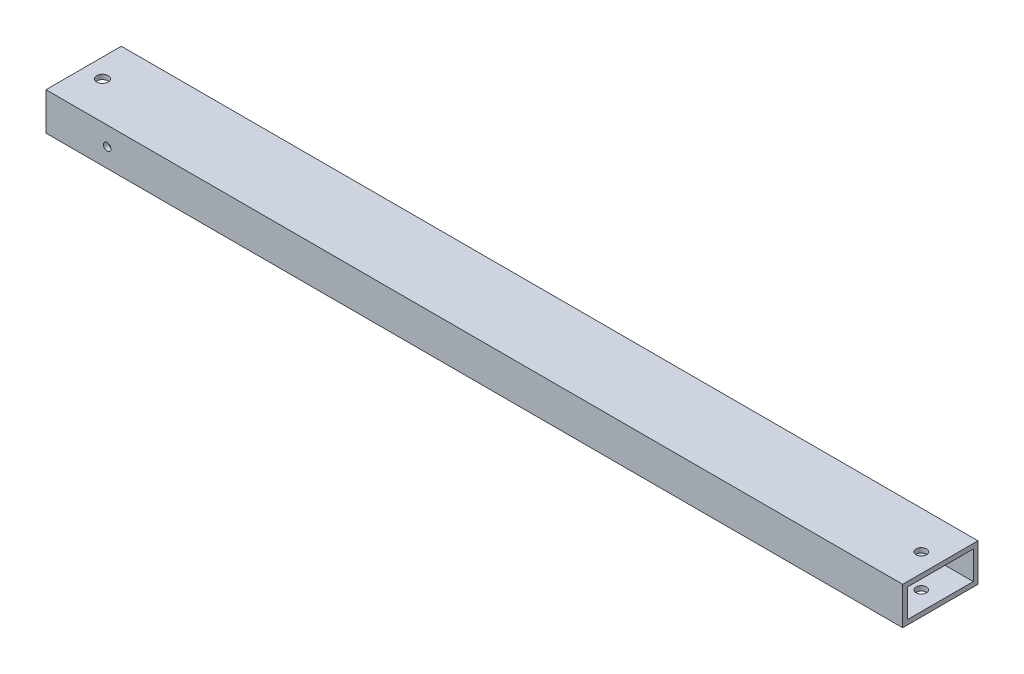
ISO-10303-21;
HEADER;
FILE_DESCRIPTION(('STEP AP214'),'2;1');
FILE_NAME('part.step','',(''),(''),'','','');
FILE_SCHEMA(('AUTOMOTIVE_DESIGN { 1 0 10303 214 1 1 1 1 }'));
ENDSEC;
DATA;
#1=APPLICATION_CONTEXT('core data for automotive mechanical design processes');
#2=APPLICATION_PROTOCOL_DEFINITION('international standard','automotive_design',2000,#1);
#3=PRODUCT_CONTEXT('',#1,'mechanical');
#4=PRODUCT('Part','Part','',(#3));
#5=PRODUCT_RELATED_PRODUCT_CATEGORY('part','',(#4));
#6=PRODUCT_DEFINITION_FORMATION('','',#4);
#7=PRODUCT_DEFINITION_CONTEXT('part definition',#1,'design');
#8=PRODUCT_DEFINITION('design','',#6,#7);
#9=PRODUCT_DEFINITION_SHAPE('','',#8);
#10=(LENGTH_UNIT() NAMED_UNIT(*) SI_UNIT(.MILLI.,.METRE.));
#11=(NAMED_UNIT(*) PLANE_ANGLE_UNIT() SI_UNIT($,.RADIAN.));
#12=(NAMED_UNIT(*) SI_UNIT($,.STERADIAN.) SOLID_ANGLE_UNIT());
#13=UNCERTAINTY_MEASURE_WITH_UNIT(LENGTH_MEASURE(1.E-05),#10,'distance_accuracy_value','');
#14=(GEOMETRIC_REPRESENTATION_CONTEXT(3) GLOBAL_UNCERTAINTY_ASSIGNED_CONTEXT((#13)) GLOBAL_UNIT_ASSIGNED_CONTEXT((#10,
#11,#12)) REPRESENTATION_CONTEXT('',''));
#15=CARTESIAN_POINT('',(0.,0.,0.));
#16=DIRECTION('',(0.,0.,1.));
#17=DIRECTION('',(1.,0.,0.));
#18=AXIS2_PLACEMENT_3D('',#15,#16,#17);
#19=CARTESIAN_POINT('',(238.313908971209,-181.299072168841,-866.236135779287));
#20=DIRECTION('',(0.,1.,0.));
#21=DIRECTION('',(0.,0.,1.));
#22=AXIS2_PLACEMENT_3D('',#19,#20,#21);
#23=CYLINDRICAL_SURFACE('',#22,5.5);
#24=CARTESIAN_POINT('',(238.313908971209,-141.299072168841,-866.236135779287));
#25=DIRECTION('',(0.,1.,0.));
#26=DIRECTION('',(0.,0.,1.));
#27=AXIS2_PLACEMENT_3D('',#24,#25,#26);
#28=CIRCLE('',#27,5.5);
#29=CARTESIAN_POINT('',(238.313908971209,-141.299072168841,-860.736135779287));
#30=VERTEX_POINT('',#29);
#31=EDGE_CURVE('E20',#30,#30,#28,.F.);
#32=ORIENTED_EDGE('',*,*,#31,.F.);
#33=EDGE_LOOP('',(#32));
#34=FACE_BOUND('',#33,.T.);
#35=CARTESIAN_POINT('',(238.313908971209,-146.29907216884,-866.236135779287));
#36=DIRECTION('',(0.,1.,0.));
#37=DIRECTION('',(0.,0.,1.));
#38=AXIS2_PLACEMENT_3D('',#35,#36,#37);
#39=CIRCLE('',#38,5.5);
#40=CARTESIAN_POINT('',(238.313908971209,-146.29907216884,-860.736135779287));
#41=VERTEX_POINT('',#40);
#42=EDGE_CURVE('E123',#41,#41,#39,.F.);
#43=ORIENTED_EDGE('',*,*,#42,.T.);
#44=EDGE_LOOP('',(#43));
#45=FACE_BOUND('',#44,.T.);
#46=ADVANCED_FACE('F17',(#34,#45),#23,.F.);
#47=CARTESIAN_POINT('',(-631.679347611488,-141.299072168841,-866.486147986318));
#48=DIRECTION('',(0.,1.,0.));
#49=DIRECTION('',(0.,0.,1.));
#50=AXIS2_PLACEMENT_3D('',#47,#48,#49);
#51=CYLINDRICAL_SURFACE('',#50,6.);
#52=CARTESIAN_POINT('',(-631.679347611488,-146.29907216884,-866.486147986318));
#53=DIRECTION('',(0.,1.,0.));
#54=DIRECTION('',(0.,0.,1.));
#55=AXIS2_PLACEMENT_3D('',#52,#53,#54);
#56=CIRCLE('',#55,6.);
#57=CARTESIAN_POINT('',(-631.679347611488,-146.29907216884,-860.486147986318));
#58=VERTEX_POINT('',#57);
#59=EDGE_CURVE('E99',#58,#58,#56,.F.);
#60=ORIENTED_EDGE('',*,*,#59,.T.);
#61=EDGE_LOOP('',(#60));
#62=FACE_BOUND('',#61,.T.);
#63=CARTESIAN_POINT('',(-631.679347611488,-141.299072168841,-866.486147986318));
#64=DIRECTION('',(0.,1.,0.));
#65=DIRECTION('',(0.,0.,1.));
#66=AXIS2_PLACEMENT_3D('',#63,#64,#65);
#67=CIRCLE('',#66,6.);
#68=CARTESIAN_POINT('',(-631.679347611488,-141.299072168841,-860.486147986318));
#69=VERTEX_POINT('',#68);
#70=EDGE_CURVE('E151',#69,#69,#67,.F.);
#71=ORIENTED_EDGE('',*,*,#70,.F.);
#72=EDGE_LOOP('',(#71));
#73=FACE_BOUND('',#72,.T.);
#74=ADVANCED_FACE('F163',(#62,#73),#51,.F.);
#75=CARTESIAN_POINT('',(-586.679347611488,-161.35907216884,-898.986147986318));
#76=DIRECTION('',(0.,0.,-1.));
#77=DIRECTION('',(-1.,0.,0.));
#78=AXIS2_PLACEMENT_3D('',#75,#76,#77);
#79=CYLINDRICAL_SURFACE('',#78,4.);
#80=CARTESIAN_POINT('',(-586.679347611488,-161.35907216884,-906.486147986318));
#81=DIRECTION('',(0.,0.,-1.));
#82=DIRECTION('',(-1.,0.,0.));
#83=AXIS2_PLACEMENT_3D('',#80,#81,#82);
#84=CIRCLE('',#83,4.);
#85=CARTESIAN_POINT('',(-590.679347611488,-161.35907216884,-906.486147986318));
#86=VERTEX_POINT('',#85);
#87=EDGE_CURVE('E115',#86,#86,#84,.F.);
#88=ORIENTED_EDGE('',*,*,#87,.F.);
#89=EDGE_LOOP('',(#88));
#90=FACE_BOUND('',#89,.T.);
#91=CARTESIAN_POINT('',(-586.679347611488,-161.35907216884,-901.486147986318));
#92=DIRECTION('',(0.,0.,-1.));
#93=DIRECTION('',(-1.,0.,0.));
#94=AXIS2_PLACEMENT_3D('',#91,#92,#93);
#95=CIRCLE('',#94,4.);
#96=CARTESIAN_POINT('',(-590.679347611488,-161.35907216884,-901.486147986318));
#97=VERTEX_POINT('',#96);
#98=EDGE_CURVE('E124',#97,#97,#95,.F.);
#99=ORIENTED_EDGE('',*,*,#98,.T.);
#100=EDGE_LOOP('',(#99));
#101=FACE_BOUND('',#100,.T.);
#102=ADVANCED_FACE('F264',(#90,#101),#79,.F.);
#103=CARTESIAN_POINT('',(-586.679347611488,-161.35907216884,-833.986147986319));
#104=DIRECTION('',(0.,0.,1.));
#105=DIRECTION('',(1.,0.,0.));
#106=AXIS2_PLACEMENT_3D('',#103,#104,#105);
#107=CYLINDRICAL_SURFACE('',#106,4.);
#108=CARTESIAN_POINT('',(-586.679347611488,-161.35907216884,-831.486147986319));
#109=DIRECTION('',(0.,0.,1.));
#110=DIRECTION('',(1.,0.,0.));
#111=AXIS2_PLACEMENT_3D('',#108,#109,#110);
#112=CIRCLE('',#111,4.);
#113=CARTESIAN_POINT('',(-582.679347611488,-161.35907216884,-831.486147986319));
#114=VERTEX_POINT('',#113);
#115=EDGE_CURVE('E98',#114,#114,#112,.F.);
#116=ORIENTED_EDGE('',*,*,#115,.T.);
#117=EDGE_LOOP('',(#116));
#118=FACE_BOUND('',#117,.T.);
#119=CARTESIAN_POINT('',(-586.679347611488,-161.35907216884,-826.486147986318));
#120=DIRECTION('',(0.,0.,1.));
#121=DIRECTION('',(1.,0.,0.));
#122=AXIS2_PLACEMENT_3D('',#119,#120,#121);
#123=CIRCLE('',#122,4.);
#124=CARTESIAN_POINT('',(-582.679347611488,-161.35907216884,-826.486147986318));
#125=VERTEX_POINT('',#124);
#126=EDGE_CURVE('E137',#125,#125,#123,.F.);
#127=ORIENTED_EDGE('',*,*,#126,.F.);
#128=EDGE_LOOP('',(#127));
#129=FACE_BOUND('',#128,.T.);
#130=ADVANCED_FACE('F259',(#118,#129),#107,.F.);
#131=CARTESIAN_POINT('',(-201.679347611488,-141.299072168841,-866.486147986318));
#132=DIRECTION('',(0.,1.,0.));
#133=DIRECTION('',(0.,0.,1.));
#134=AXIS2_PLACEMENT_3D('',#131,#132,#133);
#135=PLANE('',#134);
#136=ORIENTED_EDGE('',*,*,#70,.T.);
#137=EDGE_LOOP('',(#136));
#138=FACE_BOUND('',#137,.T.);
#139=ORIENTED_EDGE('',*,*,#31,.T.);
#140=EDGE_LOOP('',(#139));
#141=FACE_BOUND('',#140,.T.);
#142=DIRECTION('',(-1.,0.,0.));
#143=VECTOR('',#142,1.);
#144=CARTESIAN_POINT('',(-201.679347611488,-141.299072168841,-906.486147986318));
#145=LINE('',#144,#143);
#146=CARTESIAN_POINT('',(-651.679347611489,-141.299072168841,-906.486147986318));
#147=VERTEX_POINT('',#146);
#148=CARTESIAN_POINT('',(258.313908971212,-141.299072168841,-906.486147986318));
#149=VERTEX_POINT('',#148);
#150=EDGE_CURVE('E116',#147,#149,#145,.F.);
#151=ORIENTED_EDGE('',*,*,#150,.F.);
#152=DIRECTION('',(0.,0.,1.));
#153=VECTOR('',#152,1.);
#154=CARTESIAN_POINT('',(-651.679347611489,-141.299072168841,-866.486147986318));
#155=LINE('',#154,#153);
#156=CARTESIAN_POINT('',(-651.679347611489,-141.299072168841,-826.486147986318));
#157=VERTEX_POINT('',#156);
#158=EDGE_CURVE('E232',#157,#147,#155,.F.);
#159=ORIENTED_EDGE('',*,*,#158,.F.);
#160=DIRECTION('',(1.,0.,0.));
#161=VECTOR('',#160,1.);
#162=CARTESIAN_POINT('',(-201.679347611488,-141.299072168841,-826.486147986318));
#163=LINE('',#162,#161);
#164=CARTESIAN_POINT('',(258.313908971212,-141.299072168841,-826.486147986318));
#165=VERTEX_POINT('',#164);
#166=EDGE_CURVE('E141',#165,#157,#163,.F.);
#167=ORIENTED_EDGE('',*,*,#166,.F.);
#168=DIRECTION('',(0.,0.,1.));
#169=VECTOR('',#168,1.);
#170=CARTESIAN_POINT('',(258.313908971212,-141.299072168841,-866.486147986318));
#171=LINE('',#170,#169);
#172=EDGE_CURVE('E112',#165,#149,#171,.F.);
#173=ORIENTED_EDGE('',*,*,#172,.T.);
#174=EDGE_LOOP('',(#151,#159,#167,#173));
#175=FACE_BOUND('',#174,.T.);
#176=ADVANCED_FACE('F158',(#138,#141,#175),#135,.T.);
#177=CARTESIAN_POINT('',(-201.679347611488,-161.299072168841,-901.486147986318));
#178=DIRECTION('',(0.,0.,-1.));
#179=DIRECTION('',(-1.,0.,0.));
#180=AXIS2_PLACEMENT_3D('',#177,#178,#179);
#181=PLANE('',#180);
#182=ORIENTED_EDGE('',*,*,#98,.F.);
#183=EDGE_LOOP('',(#182));
#184=FACE_BOUND('',#183,.T.);
#185=DIRECTION('',(0.,1.,0.));
#186=VECTOR('',#185,1.);
#187=CARTESIAN_POINT('',(-651.679347611489,-161.299072168841,-901.486147986318));
#188=LINE('',#187,#186);
#189=CARTESIAN_POINT('',(-651.679347611489,-176.299072168841,-901.486147986318));
#190=VERTEX_POINT('',#189);
#191=CARTESIAN_POINT('',(-651.679347611489,-146.29907216884,-901.486147986318));
#192=VERTEX_POINT('',#191);
#193=EDGE_CURVE('E227',#190,#192,#188,.T.);
#194=ORIENTED_EDGE('',*,*,#193,.F.);
#195=DIRECTION('',(1.,0.,0.));
#196=VECTOR('',#195,1.);
#197=CARTESIAN_POINT('',(-201.679347611488,-176.299072168841,-901.486147986318));
#198=LINE('',#197,#196);
#199=CARTESIAN_POINT('',(258.313908971212,-176.299072168841,-901.486147986318));
#200=VERTEX_POINT('',#199);
#201=EDGE_CURVE('E119',#190,#200,#198,.T.);
#202=ORIENTED_EDGE('',*,*,#201,.T.);
#203=DIRECTION('',(0.,1.,0.));
#204=VECTOR('',#203,1.);
#205=CARTESIAN_POINT('',(258.313908971212,-161.299072168841,-901.486147986318));
#206=LINE('',#205,#204);
#207=CARTESIAN_POINT('',(258.313908971212,-146.29907216884,-901.486147986318));
#208=VERTEX_POINT('',#207);
#209=EDGE_CURVE('E107',#200,#208,#206,.T.);
#210=ORIENTED_EDGE('',*,*,#209,.T.);
#211=DIRECTION('',(1.,0.,0.));
#212=VECTOR('',#211,1.);
#213=CARTESIAN_POINT('',(-201.679347611488,-146.29907216884,-901.486147986318));
#214=LINE('',#213,#212);
#215=EDGE_CURVE('E84',#208,#192,#214,.F.);
#216=ORIENTED_EDGE('',*,*,#215,.T.);
#217=EDGE_LOOP('',(#194,#202,#210,#216));
#218=FACE_BOUND('',#217,.T.);
#219=ADVANCED_FACE('F167',(#184,#218),#181,.F.);
#220=CARTESIAN_POINT('',(-201.679347611488,-146.29907216884,-866.486147986318));
#221=DIRECTION('',(0.,1.,0.));
#222=DIRECTION('',(0.,0.,1.));
#223=AXIS2_PLACEMENT_3D('',#220,#221,#222);
#224=PLANE('',#223);
#225=ORIENTED_EDGE('',*,*,#59,.F.);
#226=EDGE_LOOP('',(#225));
#227=FACE_BOUND('',#226,.T.);
#228=ORIENTED_EDGE('',*,*,#42,.F.);
#229=EDGE_LOOP('',(#228));
#230=FACE_BOUND('',#229,.T.);
#231=DIRECTION('',(0.,0.,1.));
#232=VECTOR('',#231,1.);
#233=CARTESIAN_POINT('',(-651.679347611489,-146.29907216884,-866.486147986318));
#234=LINE('',#233,#232);
#235=CARTESIAN_POINT('',(-651.679347611489,-146.29907216884,-831.486147986319));
#236=VERTEX_POINT('',#235);
#237=EDGE_CURVE('E225',#192,#236,#234,.T.);
#238=ORIENTED_EDGE('',*,*,#237,.F.);
#239=ORIENTED_EDGE('',*,*,#215,.F.);
#240=DIRECTION('',(0.,0.,1.));
#241=VECTOR('',#240,1.);
#242=CARTESIAN_POINT('',(258.313908971212,-146.29907216884,-866.486147986318));
#243=LINE('',#242,#241);
#244=CARTESIAN_POINT('',(258.313908971212,-146.29907216884,-831.486147986319));
#245=VERTEX_POINT('',#244);
#246=EDGE_CURVE('E78',#208,#245,#243,.T.);
#247=ORIENTED_EDGE('',*,*,#246,.T.);
#248=DIRECTION('',(1.,0.,0.));
#249=VECTOR('',#248,1.);
#250=CARTESIAN_POINT('',(-201.679347611488,-146.29907216884,-831.486147986319));
#251=LINE('',#250,#249);
#252=EDGE_CURVE('E82',#245,#236,#251,.F.);
#253=ORIENTED_EDGE('',*,*,#252,.T.);
#254=EDGE_LOOP('',(#238,#239,#247,#253));
#255=FACE_BOUND('',#254,.T.);
#256=ADVANCED_FACE('F81',(#227,#230,#255),#224,.F.);
#257=CARTESIAN_POINT('',(-201.679347611488,-161.299072168841,-831.486147986319));
#258=DIRECTION('',(0.,0.,1.));
#259=DIRECTION('',(1.,0.,0.));
#260=AXIS2_PLACEMENT_3D('',#257,#258,#259);
#261=PLANE('',#260);
#262=ORIENTED_EDGE('',*,*,#115,.F.);
#263=EDGE_LOOP('',(#262));
#264=FACE_BOUND('',#263,.T.);
#265=DIRECTION('',(0.,1.,0.));
#266=VECTOR('',#265,1.);
#267=CARTESIAN_POINT('',(-651.679347611489,-161.299072168841,-831.486147986319));
#268=LINE('',#267,#266);
#269=CARTESIAN_POINT('',(-651.679347611489,-176.299072168841,-831.486147986319));
#270=VERTEX_POINT('',#269);
#271=EDGE_CURVE('E96',#236,#270,#268,.F.);
#272=ORIENTED_EDGE('',*,*,#271,.F.);
#273=ORIENTED_EDGE('',*,*,#252,.F.);
#274=DIRECTION('',(0.,1.,0.));
#275=VECTOR('',#274,1.);
#276=CARTESIAN_POINT('',(258.313908971212,-161.299072168841,-831.486147986319));
#277=LINE('',#276,#275);
#278=CARTESIAN_POINT('',(258.313908971212,-176.299072168841,-831.486147986319));
#279=VERTEX_POINT('',#278);
#280=EDGE_CURVE('E89',#245,#279,#277,.F.);
#281=ORIENTED_EDGE('',*,*,#280,.T.);
#282=DIRECTION('',(1.,0.,0.));
#283=VECTOR('',#282,1.);
#284=CARTESIAN_POINT('',(-201.679347611488,-176.299072168841,-831.486147986319));
#285=LINE('',#284,#283);
#286=EDGE_CURVE('E121',#279,#270,#285,.F.);
#287=ORIENTED_EDGE('',*,*,#286,.T.);
#288=EDGE_LOOP('',(#272,#273,#281,#287));
#289=FACE_BOUND('',#288,.T.);
#290=ADVANCED_FACE('F93',(#264,#289),#261,.F.);
#291=CARTESIAN_POINT('',(-201.679347611488,-176.299072168841,-866.486147986318));
#292=DIRECTION('',(0.,-1.,0.));
#293=DIRECTION('',(0.,0.,-1.));
#294=AXIS2_PLACEMENT_3D('',#291,#292,#293);
#295=PLANE('',#294);
#296=CARTESIAN_POINT('',(-631.679347611488,-176.299072168841,-866.486147986318));
#297=DIRECTION('',(0.,1.,0.));
#298=DIRECTION('',(0.,0.,1.));
#299=AXIS2_PLACEMENT_3D('',#296,#297,#298);
#300=CIRCLE('',#299,6.);
#301=CARTESIAN_POINT('',(-631.679347611488,-176.299072168841,-860.486147986318));
#302=VERTEX_POINT('',#301);
#303=EDGE_CURVE('E129',#302,#302,#300,.F.);
#304=ORIENTED_EDGE('',*,*,#303,.T.);
#305=EDGE_LOOP('',(#304));
#306=FACE_BOUND('',#305,.T.);
#307=CARTESIAN_POINT('',(238.313908971209,-176.299072168841,-866.236135779287));
#308=DIRECTION('',(0.,1.,0.));
#309=DIRECTION('',(0.,0.,1.));
#310=AXIS2_PLACEMENT_3D('',#307,#308,#309);
#311=CIRCLE('',#310,5.5);
#312=CARTESIAN_POINT('',(238.313908971209,-176.299072168841,-860.736135779287));
#313=VERTEX_POINT('',#312);
#314=EDGE_CURVE('E133',#313,#313,#311,.F.);
#315=ORIENTED_EDGE('',*,*,#314,.T.);
#316=EDGE_LOOP('',(#315));
#317=FACE_BOUND('',#316,.T.);
#318=DIRECTION('',(0.,0.,1.));
#319=VECTOR('',#318,1.);
#320=CARTESIAN_POINT('',(-651.679347611489,-176.299072168841,-866.486147986318));
#321=LINE('',#320,#319);
#322=EDGE_CURVE('E136',#270,#190,#321,.F.);
#323=ORIENTED_EDGE('',*,*,#322,.F.);
#324=ORIENTED_EDGE('',*,*,#286,.F.);
#325=DIRECTION('',(0.,0.,1.));
#326=VECTOR('',#325,1.);
#327=CARTESIAN_POINT('',(258.313908971212,-176.299072168841,-866.486147986318));
#328=LINE('',#327,#326);
#329=EDGE_CURVE('E105',#279,#200,#328,.F.);
#330=ORIENTED_EDGE('',*,*,#329,.T.);
#331=ORIENTED_EDGE('',*,*,#201,.F.);
#332=EDGE_LOOP('',(#323,#324,#330,#331));
#333=FACE_BOUND('',#332,.T.);
#334=ADVANCED_FACE('F175',(#306,#317,#333),#295,.F.);
#335=CARTESIAN_POINT('',(-201.679347611488,-161.299072168841,-906.486147986318));
#336=DIRECTION('',(0.,0.,-1.));
#337=DIRECTION('',(-1.,0.,0.));
#338=AXIS2_PLACEMENT_3D('',#335,#336,#337);
#339=PLANE('',#338);
#340=ORIENTED_EDGE('',*,*,#87,.T.);
#341=EDGE_LOOP('',(#340));
#342=FACE_BOUND('',#341,.T.);
#343=DIRECTION('',(1.,0.,0.));
#344=VECTOR('',#343,1.);
#345=CARTESIAN_POINT('',(-201.679347611488,-181.299072168841,-906.486147986318));
#346=LINE('',#345,#344);
#347=CARTESIAN_POINT('',(-651.679347611489,-181.299072168841,-906.486147986318));
#348=VERTEX_POINT('',#347);
#349=CARTESIAN_POINT('',(258.313908971212,-181.299072168841,-906.486147986318));
#350=VERTEX_POINT('',#349);
#351=EDGE_CURVE('E132',#348,#350,#346,.T.);
#352=ORIENTED_EDGE('',*,*,#351,.F.);
#353=DIRECTION('',(0.,1.,0.));
#354=VECTOR('',#353,1.);
#355=CARTESIAN_POINT('',(-651.679347611489,-161.299072168841,-906.486147986318));
#356=LINE('',#355,#354);
#357=EDGE_CURVE('E140',#147,#348,#356,.F.);
#358=ORIENTED_EDGE('',*,*,#357,.F.);
#359=ORIENTED_EDGE('',*,*,#150,.T.);
#360=DIRECTION('',(0.,1.,0.));
#361=VECTOR('',#360,1.);
#362=CARTESIAN_POINT('',(258.313908971212,-161.299072168841,-906.486147986318));
#363=LINE('',#362,#361);
#364=EDGE_CURVE('E90',#149,#350,#363,.F.);
#365=ORIENTED_EDGE('',*,*,#364,.T.);
#366=EDGE_LOOP('',(#352,#358,#359,#365));
#367=FACE_BOUND('',#366,.T.);
#368=ADVANCED_FACE('F207',(#342,#367),#339,.T.);
#369=CARTESIAN_POINT('',(258.313908971212,-161.299072168841,-866.486147986318));
#370=DIRECTION('',(-1.,0.,0.));
#371=DIRECTION('',(0.,0.,1.));
#372=AXIS2_PLACEMENT_3D('',#369,#370,#371);
#373=PLANE('',#372);
#374=ORIENTED_EDGE('',*,*,#329,.F.);
#375=ORIENTED_EDGE('',*,*,#280,.F.);
#376=ORIENTED_EDGE('',*,*,#246,.F.);
#377=ORIENTED_EDGE('',*,*,#209,.F.);
#378=EDGE_LOOP('',(#374,#375,#376,#377));
#379=FACE_BOUND('',#378,.T.);
#380=ORIENTED_EDGE('',*,*,#172,.F.);
#381=DIRECTION('',(0.,1.,0.));
#382=VECTOR('',#381,1.);
#383=CARTESIAN_POINT('',(258.313908971212,-161.299072168841,-826.486147986318));
#384=LINE('',#383,#382);
#385=CARTESIAN_POINT('',(258.313908971212,-181.299072168841,-826.486147986318));
#386=VERTEX_POINT('',#385);
#387=EDGE_CURVE('E239',#386,#165,#384,.T.);
#388=ORIENTED_EDGE('',*,*,#387,.F.);
#389=DIRECTION('',(0.,0.,-1.));
#390=VECTOR('',#389,1.);
#391=CARTESIAN_POINT('',(258.313908971212,-181.299072168841,-866.486147986318));
#392=LINE('',#391,#390);
#393=EDGE_CURVE('E249',#350,#386,#392,.F.);
#394=ORIENTED_EDGE('',*,*,#393,.F.);
#395=ORIENTED_EDGE('',*,*,#364,.F.);
#396=EDGE_LOOP('',(#380,#388,#394,#395));
#397=FACE_BOUND('',#396,.T.);
#398=ADVANCED_FACE('F102',(#379,#397),#373,.F.);
#399=CARTESIAN_POINT('',(-201.679347611488,-161.299072168841,-826.486147986318));
#400=DIRECTION('',(0.,0.,1.));
#401=DIRECTION('',(1.,0.,0.));
#402=AXIS2_PLACEMENT_3D('',#399,#400,#401);
#403=PLANE('',#402);
#404=ORIENTED_EDGE('',*,*,#126,.T.);
#405=EDGE_LOOP('',(#404));
#406=FACE_BOUND('',#405,.T.);
#407=ORIENTED_EDGE('',*,*,#166,.T.);
#408=DIRECTION('',(0.,1.,0.));
#409=VECTOR('',#408,1.);
#410=CARTESIAN_POINT('',(-651.679347611489,-161.299072168841,-826.486147986318));
#411=LINE('',#410,#409);
#412=CARTESIAN_POINT('',(-651.679347611489,-181.299072168841,-826.486147986318));
#413=VERTEX_POINT('',#412);
#414=EDGE_CURVE('E35',#413,#157,#411,.T.);
#415=ORIENTED_EDGE('',*,*,#414,.F.);
#416=DIRECTION('',(1.,0.,0.));
#417=VECTOR('',#416,1.);
#418=CARTESIAN_POINT('',(-201.679347611488,-181.299072168841,-826.486147986318));
#419=LINE('',#418,#417);
#420=EDGE_CURVE('E245',#386,#413,#419,.F.);
#421=ORIENTED_EDGE('',*,*,#420,.F.);
#422=ORIENTED_EDGE('',*,*,#387,.T.);
#423=EDGE_LOOP('',(#407,#415,#421,#422));
#424=FACE_BOUND('',#423,.T.);
#425=ADVANCED_FACE('F200',(#406,#424),#403,.T.);
#426=CARTESIAN_POINT('',(-651.679347611489,-161.299072168841,-866.486147986318));
#427=DIRECTION('',(-1.,0.,0.));
#428=DIRECTION('',(0.,0.,1.));
#429=AXIS2_PLACEMENT_3D('',#426,#427,#428);
#430=PLANE('',#429);
#431=ORIENTED_EDGE('',*,*,#271,.T.);
#432=ORIENTED_EDGE('',*,*,#322,.T.);
#433=ORIENTED_EDGE('',*,*,#193,.T.);
#434=ORIENTED_EDGE('',*,*,#237,.T.);
#435=EDGE_LOOP('',(#431,#432,#433,#434));
#436=FACE_BOUND('',#435,.T.);
#437=ORIENTED_EDGE('',*,*,#414,.T.);
#438=ORIENTED_EDGE('',*,*,#158,.T.);
#439=ORIENTED_EDGE('',*,*,#357,.T.);
#440=DIRECTION('',(0.,0.,-1.));
#441=VECTOR('',#440,1.);
#442=CARTESIAN_POINT('',(-651.679347611489,-181.299072168841,-866.486147986318));
#443=LINE('',#442,#441);
#444=EDGE_CURVE('E128',#413,#348,#443,.T.);
#445=ORIENTED_EDGE('',*,*,#444,.F.);
#446=EDGE_LOOP('',(#437,#438,#439,#445));
#447=FACE_BOUND('',#446,.T.);
#448=ADVANCED_FACE('F196',(#436,#447),#430,.T.);
#449=CARTESIAN_POINT('',(238.313908971209,-181.299072168841,-866.236135779287));
#450=DIRECTION('',(0.,1.,0.));
#451=DIRECTION('',(0.,0.,1.));
#452=AXIS2_PLACEMENT_3D('',#449,#450,#451);
#453=CYLINDRICAL_SURFACE('',#452,5.5);
#454=CARTESIAN_POINT('',(238.313908971209,-181.299072168841,-866.236135779287));
#455=DIRECTION('',(0.,1.,0.));
#456=DIRECTION('',(0.,0.,1.));
#457=AXIS2_PLACEMENT_3D('',#454,#455,#456);
#458=CIRCLE('',#457,5.5);
#459=CARTESIAN_POINT('',(238.313908971209,-181.299072168841,-860.736135779287));
#460=VERTEX_POINT('',#459);
#461=EDGE_CURVE('E26',#460,#460,#458,.T.);
#462=ORIENTED_EDGE('',*,*,#461,.F.);
#463=EDGE_LOOP('',(#462));
#464=FACE_BOUND('',#463,.T.);
#465=ORIENTED_EDGE('',*,*,#314,.F.);
#466=EDGE_LOOP('',(#465));
#467=FACE_BOUND('',#466,.T.);
#468=ADVANCED_FACE('F189',(#464,#467),#453,.F.);
#469=CARTESIAN_POINT('',(-631.679347611488,-141.299072168841,-866.486147986318));
#470=DIRECTION('',(0.,1.,0.));
#471=DIRECTION('',(0.,0.,1.));
#472=AXIS2_PLACEMENT_3D('',#469,#470,#471);
#473=CYLINDRICAL_SURFACE('',#472,6.);
#474=CARTESIAN_POINT('',(-631.679347611488,-181.299072168841,-866.486147986318));
#475=DIRECTION('',(0.,1.,0.));
#476=DIRECTION('',(0.,0.,1.));
#477=AXIS2_PLACEMENT_3D('',#474,#475,#476);
#478=CIRCLE('',#477,6.);
#479=CARTESIAN_POINT('',(-631.679347611488,-181.299072168841,-860.486147986318));
#480=VERTEX_POINT('',#479);
#481=EDGE_CURVE('E11',#480,#480,#478,.T.);
#482=ORIENTED_EDGE('',*,*,#481,.F.);
#483=EDGE_LOOP('',(#482));
#484=FACE_BOUND('',#483,.T.);
#485=ORIENTED_EDGE('',*,*,#303,.F.);
#486=EDGE_LOOP('',(#485));
#487=FACE_BOUND('',#486,.T.);
#488=ADVANCED_FACE('F183',(#484,#487),#473,.F.);
#489=CARTESIAN_POINT('',(-201.679347611488,-181.299072168841,-866.486147986318));
#490=DIRECTION('',(0.,-1.,0.));
#491=DIRECTION('',(0.,0.,-1.));
#492=AXIS2_PLACEMENT_3D('',#489,#490,#491);
#493=PLANE('',#492);
#494=ORIENTED_EDGE('',*,*,#481,.T.);
#495=EDGE_LOOP('',(#494));
#496=FACE_BOUND('',#495,.T.);
#497=ORIENTED_EDGE('',*,*,#461,.T.);
#498=EDGE_LOOP('',(#497));
#499=FACE_BOUND('',#498,.T.);
#500=ORIENTED_EDGE('',*,*,#420,.T.);
#501=ORIENTED_EDGE('',*,*,#444,.T.);
#502=ORIENTED_EDGE('',*,*,#351,.T.);
#503=ORIENTED_EDGE('',*,*,#393,.T.);
#504=EDGE_LOOP('',(#500,#501,#502,#503));
#505=FACE_BOUND('',#504,.T.);
#506=ADVANCED_FACE('F181',(#496,#499,#505),#493,.T.);
#507=CLOSED_SHELL('',(#46,#74,#102,#130,#176,#219,#256,#290,#334,#368,#398,#425,#448,#468,#488,#506));
#508=MANIFOLD_SOLID_BREP('B1',#507);
#509=ADVANCED_BREP_SHAPE_REPRESENTATION('',(#18,#508),#14);
#510=SHAPE_DEFINITION_REPRESENTATION(#9,#509);
ENDSEC;
END-ISO-10303-21;
